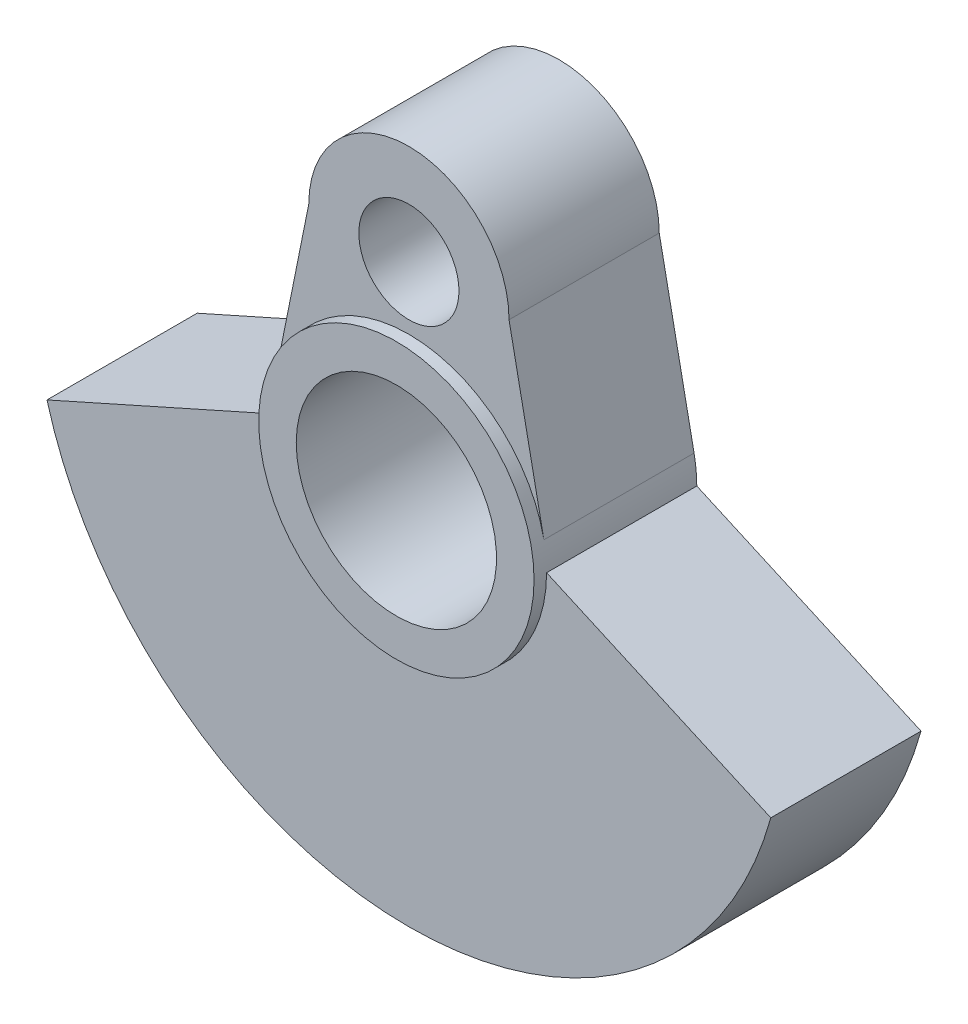
ISO-10303-21;
HEADER;
FILE_DESCRIPTION(('STEP AP214'),'2;1');
FILE_NAME('part.step','',(''),(''),'','','');
FILE_SCHEMA(('AUTOMOTIVE_DESIGN { 1 0 10303 214 1 1 1 1 }'));
ENDSEC;
DATA;
#1=APPLICATION_CONTEXT('core data for automotive mechanical design processes');
#2=APPLICATION_PROTOCOL_DEFINITION('international standard','automotive_design',2000,#1);
#3=PRODUCT_CONTEXT('',#1,'mechanical');
#4=PRODUCT('Part','Part','',(#3));
#5=PRODUCT_RELATED_PRODUCT_CATEGORY('part','',(#4));
#6=PRODUCT_DEFINITION_FORMATION('','',#4);
#7=PRODUCT_DEFINITION_CONTEXT('part definition',#1,'design');
#8=PRODUCT_DEFINITION('design','',#6,#7);
#9=PRODUCT_DEFINITION_SHAPE('','',#8);
#10=(LENGTH_UNIT() NAMED_UNIT(*) SI_UNIT(.MILLI.,.METRE.));
#11=(NAMED_UNIT(*) PLANE_ANGLE_UNIT() SI_UNIT($,.RADIAN.));
#12=(NAMED_UNIT(*) SI_UNIT($,.STERADIAN.) SOLID_ANGLE_UNIT());
#13=UNCERTAINTY_MEASURE_WITH_UNIT(LENGTH_MEASURE(1.E-05),#10,'distance_accuracy_value','');
#14=(GEOMETRIC_REPRESENTATION_CONTEXT(3) GLOBAL_UNCERTAINTY_ASSIGNED_CONTEXT((#13)) GLOBAL_UNIT_ASSIGNED_CONTEXT((#10,
#11,#12)) REPRESENTATION_CONTEXT('',''));
#15=CARTESIAN_POINT('',(0.,0.,0.));
#16=DIRECTION('',(0.,0.,1.));
#17=DIRECTION('',(1.,0.,0.));
#18=AXIS2_PLACEMENT_3D('',#15,#16,#17);
#19=CARTESIAN_POINT('',(0.,0.,3.5));
#20=DIRECTION('',(0.,0.,-1.));
#21=DIRECTION('',(-1.,0.,0.));
#22=AXIS2_PLACEMENT_3D('',#19,#20,#21);
#23=CYLINDRICAL_SURFACE('',#22,5.5);
#24=CARTESIAN_POINT('',(0.,0.,3.5));
#25=DIRECTION('',(0.,0.,1.));
#26=DIRECTION('',(1.,0.,0.));
#27=AXIS2_PLACEMENT_3D('',#24,#25,#26);
#28=CIRCLE('',#27,5.5);
#29=CARTESIAN_POINT('',(5.5,0.,3.5));
#30=VERTEX_POINT('',#29);
#31=EDGE_CURVE('E176',#30,#30,#28,.T.);
#32=ORIENTED_EDGE('',*,*,#31,.F.);
#33=EDGE_LOOP('',(#32));
#34=FACE_BOUND('',#33,.T.);
#35=DIRECTION('',(0.,0.,-1.));
#36=VECTOR('',#35,1.);
#37=CARTESIAN_POINT('',(5.39185239440812,1.08532380279594,3.));
#38=LINE('',#37,#36);
#39=CARTESIAN_POINT('',(5.39185239440812,1.08532380279594,3.));
#40=VERTEX_POINT('',#39);
#41=CARTESIAN_POINT('',(5.39185239440812,1.08532380279594,-3.));
#42=VERTEX_POINT('',#41);
#43=EDGE_CURVE('E70',#40,#42,#38,.T.);
#44=ORIENTED_EDGE('',*,*,#43,.F.);
#45=CARTESIAN_POINT('',(0.,0.,3.));
#46=DIRECTION('',(0.,0.,1.));
#47=DIRECTION('',(1.,0.,0.));
#48=AXIS2_PLACEMENT_3D('',#45,#46,#47);
#49=CIRCLE('',#48,5.5);
#50=CARTESIAN_POINT('',(-5.39185239440812,1.08532380279594,3.));
#51=VERTEX_POINT('',#50);
#52=EDGE_CURVE('E65',#40,#51,#49,.T.);
#53=ORIENTED_EDGE('',*,*,#52,.T.);
#54=DIRECTION('',(0.,0.,-1.));
#55=VECTOR('',#54,1.);
#56=CARTESIAN_POINT('',(-5.39185239440812,1.08532380279594,3.));
#57=LINE('',#56,#55);
#58=CARTESIAN_POINT('',(-5.39185239440812,1.08532380279594,-3.));
#59=VERTEX_POINT('',#58);
#60=EDGE_CURVE('E163',#51,#59,#57,.T.);
#61=ORIENTED_EDGE('',*,*,#60,.T.);
#62=CARTESIAN_POINT('',(0.,0.,-3.));
#63=DIRECTION('',(0.,0.,1.));
#64=DIRECTION('',(1.,0.,0.));
#65=AXIS2_PLACEMENT_3D('',#62,#63,#64);
#66=CIRCLE('',#65,5.5);
#67=CARTESIAN_POINT('',(-5.5,0.,-3.));
#68=VERTEX_POINT('',#67);
#69=EDGE_CURVE('E172',#59,#68,#66,.T.);
#70=ORIENTED_EDGE('',*,*,#69,.T.);
#71=DIRECTION('',(0.,0.,-1.));
#72=VECTOR('',#71,1.);
#73=CARTESIAN_POINT('',(-5.5,0.,3.));
#74=LINE('',#73,#72);
#75=CARTESIAN_POINT('',(-5.5,0.,3.));
#76=VERTEX_POINT('',#75);
#77=EDGE_CURVE('E199',#76,#68,#74,.T.);
#78=ORIENTED_EDGE('',*,*,#77,.F.);
#79=CARTESIAN_POINT('',(0.,0.,3.));
#80=DIRECTION('',(0.,0.,1.));
#81=DIRECTION('',(1.,0.,0.));
#82=AXIS2_PLACEMENT_3D('',#79,#80,#81);
#83=CIRCLE('',#82,5.5);
#84=CARTESIAN_POINT('',(5.5,0.,3.));
#85=VERTEX_POINT('',#84);
#86=EDGE_CURVE('E196',#76,#85,#83,.T.);
#87=ORIENTED_EDGE('',*,*,#86,.T.);
#88=DIRECTION('',(0.,0.,-1.));
#89=VECTOR('',#88,1.);
#90=CARTESIAN_POINT('',(5.5,0.,3.));
#91=LINE('',#90,#89);
#92=CARTESIAN_POINT('',(5.5,0.,-3.));
#93=VERTEX_POINT('',#92);
#94=EDGE_CURVE('E212',#85,#93,#91,.T.);
#95=ORIENTED_EDGE('',*,*,#94,.T.);
#96=EDGE_CURVE('E181',#93,#42,#66,.T.);
#97=ORIENTED_EDGE('',*,*,#96,.T.);
#98=EDGE_LOOP('',(#44,#53,#61,#70,#78,#87,#95,#97));
#99=FACE_BOUND('',#98,.T.);
#100=ADVANCED_FACE('F49',(#34,#99),#23,.T.);
#101=CARTESIAN_POINT('',(-0.914524728224361,2.04781115503851,3.));
#102=DIRECTION('',(-0.407771042759929,0.9130842111692,0.));
#103=DIRECTION('',(-0.9130842111692,-0.407771042759929,0.));
#104=AXIS2_PLACEMENT_3D('',#101,#102,#103);
#105=PLANE('',#104);
#106=DIRECTION('',(0.9130842111692,0.407771042759929,0.));
#107=VECTOR('',#106,1.);
#108=CARTESIAN_POINT('',(-0.914524728224361,2.04781115503851,-3.));
#109=LINE('',#108,#107);
#110=CARTESIAN_POINT('',(-14.456832294801,-4.,-3.));
#111=VERTEX_POINT('',#110);
#112=EDGE_CURVE('E180',#111,#68,#109,.T.);
#113=ORIENTED_EDGE('',*,*,#112,.F.);
#114=DIRECTION('',(0.,0.,-1.));
#115=VECTOR('',#114,1.);
#116=CARTESIAN_POINT('',(-14.456832294801,-4.,3.));
#117=LINE('',#116,#115);
#118=CARTESIAN_POINT('',(-14.456832294801,-4.,3.));
#119=VERTEX_POINT('',#118);
#120=EDGE_CURVE('E12',#119,#111,#117,.T.);
#121=ORIENTED_EDGE('',*,*,#120,.F.);
#122=DIRECTION('',(0.9130842111692,0.407771042759929,0.));
#123=VECTOR('',#122,1.);
#124=CARTESIAN_POINT('',(-0.914524728224361,2.04781115503851,3.));
#125=LINE('',#124,#123);
#126=EDGE_CURVE('E184',#119,#76,#125,.T.);
#127=ORIENTED_EDGE('',*,*,#126,.T.);
#128=ORIENTED_EDGE('',*,*,#77,.T.);
#129=EDGE_LOOP('',(#113,#121,#127,#128));
#130=FACE_BOUND('',#129,.T.);
#131=ADVANCED_FACE('F51',(#130),#105,.T.);
#132=CARTESIAN_POINT('',(0.,0.,3.));
#133=DIRECTION('',(0.,0.,-1.));
#134=DIRECTION('',(-1.,0.,0.));
#135=AXIS2_PLACEMENT_3D('',#132,#133,#134);
#136=CYLINDRICAL_SURFACE('',#135,15.);
#137=CARTESIAN_POINT('',(0.,0.,-3.));
#138=DIRECTION('',(0.,0.,1.));
#139=DIRECTION('',(1.,0.,0.));
#140=AXIS2_PLACEMENT_3D('',#137,#138,#139);
#141=CIRCLE('',#140,15.);
#142=CARTESIAN_POINT('',(14.456832294801,-4.,-3.));
#143=VERTEX_POINT('',#142);
#144=EDGE_CURVE('E203',#111,#143,#141,.T.);
#145=ORIENTED_EDGE('',*,*,#144,.T.);
#146=DIRECTION('',(0.,0.,-1.));
#147=VECTOR('',#146,1.);
#148=CARTESIAN_POINT('',(14.456832294801,-4.,3.));
#149=LINE('',#148,#147);
#150=CARTESIAN_POINT('',(14.456832294801,-4.,3.));
#151=VERTEX_POINT('',#150);
#152=EDGE_CURVE('E58',#151,#143,#149,.T.);
#153=ORIENTED_EDGE('',*,*,#152,.F.);
#154=CARTESIAN_POINT('',(0.,0.,3.));
#155=DIRECTION('',(0.,0.,1.));
#156=DIRECTION('',(1.,0.,0.));
#157=AXIS2_PLACEMENT_3D('',#154,#155,#156);
#158=CIRCLE('',#157,15.);
#159=EDGE_CURVE('E188',#119,#151,#158,.T.);
#160=ORIENTED_EDGE('',*,*,#159,.F.);
#161=ORIENTED_EDGE('',*,*,#120,.T.);
#162=EDGE_LOOP('',(#145,#153,#160,#161));
#163=FACE_BOUND('',#162,.T.);
#164=ADVANCED_FACE('F234',(#163),#136,.T.);
#165=CARTESIAN_POINT('',(0.914524728224361,2.04781115503851,3.));
#166=DIRECTION('',(-0.407771042759929,-0.9130842111692,0.));
#167=DIRECTION('',(0.9130842111692,-0.407771042759929,0.));
#168=AXIS2_PLACEMENT_3D('',#165,#166,#167);
#169=PLANE('',#168);
#170=DIRECTION('',(-0.9130842111692,0.407771042759929,0.));
#171=VECTOR('',#170,1.);
#172=CARTESIAN_POINT('',(0.914524728224361,2.04781115503851,-3.));
#173=LINE('',#172,#171);
#174=EDGE_CURVE('E189',#143,#93,#173,.T.);
#175=ORIENTED_EDGE('',*,*,#174,.T.);
#176=ORIENTED_EDGE('',*,*,#94,.F.);
#177=DIRECTION('',(-0.9130842111692,0.407771042759929,0.));
#178=VECTOR('',#177,1.);
#179=CARTESIAN_POINT('',(0.914524728224361,2.04781115503851,3.));
#180=LINE('',#179,#178);
#181=EDGE_CURVE('E192',#151,#85,#180,.T.);
#182=ORIENTED_EDGE('',*,*,#181,.F.);
#183=ORIENTED_EDGE('',*,*,#152,.T.);
#184=EDGE_LOOP('',(#175,#176,#182,#183));
#185=FACE_BOUND('',#184,.T.);
#186=ADVANCED_FACE('F221',(#185),#169,.F.);
#187=CARTESIAN_POINT('',(0.,0.,3.));
#188=DIRECTION('',(0.,0.,1.));
#189=DIRECTION('',(1.,0.,0.));
#190=AXIS2_PLACEMENT_3D('',#187,#188,#189);
#191=PLANE('',#190);
#192=ORIENTED_EDGE('',*,*,#126,.F.);
#193=ORIENTED_EDGE('',*,*,#159,.T.);
#194=ORIENTED_EDGE('',*,*,#181,.T.);
#195=ORIENTED_EDGE('',*,*,#86,.F.);
#196=EDGE_LOOP('',(#192,#193,#194,#195));
#197=FACE_BOUND('',#196,.T.);
#198=ADVANCED_FACE('F233',(#197),#191,.T.);
#199=CARTESIAN_POINT('',(0.,0.,-3.));
#200=DIRECTION('',(0.,0.,1.));
#201=DIRECTION('',(1.,0.,0.));
#202=AXIS2_PLACEMENT_3D('',#199,#200,#201);
#203=PLANE('',#202);
#204=ORIENTED_EDGE('',*,*,#112,.T.);
#205=ORIENTED_EDGE('',*,*,#69,.F.);
#206=DIRECTION('',(-0.197331600508353,-0.980336798983294,0.));
#207=VECTOR('',#206,1.);
#208=CARTESIAN_POINT('',(-5.39185239440812,1.08532380279594,-3.));
#209=LINE('',#208,#207);
#210=CARTESIAN_POINT('',(-4.,8.,-3.));
#211=VERTEX_POINT('',#210);
#212=EDGE_CURVE('E142',#211,#59,#209,.T.);
#213=ORIENTED_EDGE('',*,*,#212,.F.);
#214=CARTESIAN_POINT('',(0.,8.,-3.));
#215=DIRECTION('',(0.,0.,1.));
#216=DIRECTION('',(1.,0.,0.));
#217=AXIS2_PLACEMENT_3D('',#214,#215,#216);
#218=CIRCLE('',#217,4.);
#219=CARTESIAN_POINT('',(4.,8.,-3.));
#220=VERTEX_POINT('',#219);
#221=EDGE_CURVE('E155',#220,#211,#218,.T.);
#222=ORIENTED_EDGE('',*,*,#221,.F.);
#223=DIRECTION('',(0.197331600508353,-0.980336798983294,0.));
#224=VECTOR('',#223,1.);
#225=CARTESIAN_POINT('',(5.39185239440812,1.08532380279594,-3.));
#226=LINE('',#225,#224);
#227=EDGE_CURVE('E119',#220,#42,#226,.T.);
#228=ORIENTED_EDGE('',*,*,#227,.T.);
#229=ORIENTED_EDGE('',*,*,#96,.F.);
#230=ORIENTED_EDGE('',*,*,#174,.F.);
#231=ORIENTED_EDGE('',*,*,#144,.F.);
#232=EDGE_LOOP('',(#204,#205,#213,#222,#228,#229,#230,#231));
#233=FACE_BOUND('',#232,.T.);
#234=CARTESIAN_POINT('',(0.,0.,-3.));
#235=DIRECTION('',(0.,0.,1.));
#236=DIRECTION('',(1.,0.,0.));
#237=AXIS2_PLACEMENT_3D('',#234,#235,#236);
#238=CIRCLE('',#237,4.);
#239=CARTESIAN_POINT('',(-4.,0.,-3.));
#240=VERTEX_POINT('',#239);
#241=EDGE_CURVE('E124',#240,#240,#238,.T.);
#242=ORIENTED_EDGE('',*,*,#241,.T.);
#243=EDGE_LOOP('',(#242));
#244=FACE_BOUND('',#243,.T.);
#245=CARTESIAN_POINT('',(0.,8.,-3.));
#246=DIRECTION('',(0.,0.,1.));
#247=DIRECTION('',(1.,0.,0.));
#248=AXIS2_PLACEMENT_3D('',#245,#246,#247);
#249=CIRCLE('',#248,2.);
#250=CARTESIAN_POINT('',(2.,8.,-3.));
#251=VERTEX_POINT('',#250);
#252=EDGE_CURVE('E149',#251,#251,#249,.T.);
#253=ORIENTED_EDGE('',*,*,#252,.T.);
#254=EDGE_LOOP('',(#253));
#255=FACE_BOUND('',#254,.T.);
#256=ADVANCED_FACE('F227',(#233,#244,#255),#203,.F.);
#257=CARTESIAN_POINT('',(0.,0.,3.5));
#258=DIRECTION('',(0.,0.,1.));
#259=DIRECTION('',(1.,0.,0.));
#260=AXIS2_PLACEMENT_3D('',#257,#258,#259);
#261=PLANE('',#260);
#262=ORIENTED_EDGE('',*,*,#31,.T.);
#263=EDGE_LOOP('',(#262));
#264=FACE_BOUND('',#263,.T.);
#265=CARTESIAN_POINT('',(0.,0.,3.5));
#266=DIRECTION('',(0.,0.,1.));
#267=DIRECTION('',(1.,0.,0.));
#268=AXIS2_PLACEMENT_3D('',#265,#266,#267);
#269=CIRCLE('',#268,4.);
#270=CARTESIAN_POINT('',(-4.,0.,3.5));
#271=VERTEX_POINT('',#270);
#272=EDGE_CURVE('E168',#271,#271,#269,.T.);
#273=ORIENTED_EDGE('',*,*,#272,.F.);
#274=EDGE_LOOP('',(#273));
#275=FACE_BOUND('',#274,.T.);
#276=ADVANCED_FACE('F260',(#264,#275),#261,.T.);
#277=CARTESIAN_POINT('',(0.,0.,3.5));
#278=DIRECTION('',(0.,0.,-1.));
#279=DIRECTION('',(-1.,0.,0.));
#280=AXIS2_PLACEMENT_3D('',#277,#278,#279);
#281=CYLINDRICAL_SURFACE('',#280,4.);
#282=CARTESIAN_POINT('',(-4.,0.,3.5));
#283=CARTESIAN_POINT('',(-4.,0.,3.43229166666667));
#284=CARTESIAN_POINT('',(-4.,0.,3.36458333333333));
#285=CARTESIAN_POINT('',(-4.,0.,3.22916666666667));
#286=CARTESIAN_POINT('',(-4.,0.,3.16145833333333));
#287=CARTESIAN_POINT('',(-4.,0.,3.02604166666667));
#288=CARTESIAN_POINT('',(-4.,0.,2.95833333333333));
#289=CARTESIAN_POINT('',(-4.,0.,2.82291666666667));
#290=CARTESIAN_POINT('',(-4.,0.,2.75520833333333));
#291=CARTESIAN_POINT('',(-4.,0.,2.61979166666667));
#292=CARTESIAN_POINT('',(-4.,0.,2.55208333333333));
#293=CARTESIAN_POINT('',(-4.,0.,2.41666666666667));
#294=CARTESIAN_POINT('',(-4.,0.,2.34895833333333));
#295=CARTESIAN_POINT('',(-4.,0.,2.21354166666667));
#296=CARTESIAN_POINT('',(-4.,0.,2.14583333333333));
#297=CARTESIAN_POINT('',(-4.,0.,2.01041666666667));
#298=CARTESIAN_POINT('',(-4.,0.,1.94270833333333));
#299=CARTESIAN_POINT('',(-4.,0.,1.80729166666667));
#300=CARTESIAN_POINT('',(-4.,0.,1.73958333333333));
#301=CARTESIAN_POINT('',(-4.,0.,1.60416666666667));
#302=CARTESIAN_POINT('',(-4.,0.,1.53645833333333));
#303=CARTESIAN_POINT('',(-4.,0.,1.40104166666667));
#304=CARTESIAN_POINT('',(-4.,0.,1.33333333333333));
#305=CARTESIAN_POINT('',(-4.,0.,1.19791666666667));
#306=CARTESIAN_POINT('',(-4.,0.,1.13020833333333));
#307=CARTESIAN_POINT('',(-4.,0.,0.994791666666666));
#308=CARTESIAN_POINT('',(-4.,0.,0.927083333333333));
#309=CARTESIAN_POINT('',(-4.,0.,0.791666666666666));
#310=CARTESIAN_POINT('',(-4.,0.,0.723958333333333));
#311=CARTESIAN_POINT('',(-4.,0.,0.588541666666666));
#312=CARTESIAN_POINT('',(-4.,0.,0.520833333333333));
#313=CARTESIAN_POINT('',(-4.,0.,0.385416666666666));
#314=CARTESIAN_POINT('',(-4.,0.,0.317708333333333));
#315=CARTESIAN_POINT('',(-4.,0.,0.182291666666666));
#316=CARTESIAN_POINT('',(-4.,0.,0.114583333333333));
#317=CARTESIAN_POINT('',(-4.,0.,-0.0208333333333341));
#318=CARTESIAN_POINT('',(-4.,0.,-0.0885416666666673));
#319=CARTESIAN_POINT('',(-4.,0.,-0.223958333333334));
#320=CARTESIAN_POINT('',(-4.,0.,-0.291666666666667));
#321=CARTESIAN_POINT('',(-4.,0.,-0.427083333333334));
#322=CARTESIAN_POINT('',(-4.,0.,-0.494791666666667));
#323=CARTESIAN_POINT('',(-4.,0.,-0.630208333333333));
#324=CARTESIAN_POINT('',(-4.,0.,-0.697916666666666));
#325=CARTESIAN_POINT('',(-4.,0.,-0.833333333333333));
#326=CARTESIAN_POINT('',(-4.,0.,-0.901041666666667));
#327=CARTESIAN_POINT('',(-4.,0.,-1.03645833333333));
#328=CARTESIAN_POINT('',(-4.,0.,-1.10416666666667));
#329=CARTESIAN_POINT('',(-4.,0.,-1.23958333333333));
#330=CARTESIAN_POINT('',(-4.,0.,-1.30729166666667));
#331=CARTESIAN_POINT('',(-4.,0.,-1.44270833333333));
#332=CARTESIAN_POINT('',(-4.,0.,-1.51041666666667));
#333=CARTESIAN_POINT('',(-4.,0.,-1.64583333333333));
#334=CARTESIAN_POINT('',(-4.,0.,-1.71354166666667));
#335=CARTESIAN_POINT('',(-4.,0.,-1.84895833333333));
#336=CARTESIAN_POINT('',(-4.,0.,-1.91666666666667));
#337=CARTESIAN_POINT('',(-4.,0.,-2.05208333333333));
#338=CARTESIAN_POINT('',(-4.,0.,-2.11979166666667));
#339=CARTESIAN_POINT('',(-4.,0.,-2.25520833333333));
#340=CARTESIAN_POINT('',(-4.,0.,-2.32291666666667));
#341=CARTESIAN_POINT('',(-4.,0.,-2.45833333333333));
#342=CARTESIAN_POINT('',(-4.,0.,-2.52604166666667));
#343=CARTESIAN_POINT('',(-4.,0.,-2.66145833333333));
#344=CARTESIAN_POINT('',(-4.,0.,-2.72916666666667));
#345=CARTESIAN_POINT('',(-4.,0.,-2.86458333333333));
#346=CARTESIAN_POINT('',(-4.,0.,-2.93229166666667));
#347=CARTESIAN_POINT('',(-4.,0.,-3.));
#348=B_SPLINE_CURVE_WITH_KNOTS('',3,(#282,#283,#284,#285,#286,#287,#288,#289,#290,#291,#292,
#293,#294,#295,#296,#297,#298,#299,#300,#301,#302,#303,#304,#305,#306,#307,#308,#309,#310,#311,
#312,#313,#314,#315,#316,#317,#318,#319,#320,#321,#322,#323,#324,#325,#326,#327,#328,#329,#330,
#331,#332,#333,#334,#335,#336,#337,#338,#339,#340,#341,#342,#343,#344,#345,#346,#347),
.UNSPECIFIED.,.F.,.F.,(4,2,2,2,2,2,2,2,2,2,2,2,2,2,2,2,2,2,2,2,2,2,2,2,2,2,2,2,2,2,2,2,4),(0.,
0.203125,0.40625,0.609375,0.8125,1.015625,1.21875,1.421875,1.625,1.828125,2.03125,2.234375,
2.4375,2.640625,2.84375,3.046875,3.25,3.453125,3.65625,3.859375,4.0625,4.265625,4.46875,
4.671875,4.875,5.078125,5.28125,5.484375,5.6875,5.890625,6.09375,6.296875,6.5),.UNSPECIFIED.);
#349=EDGE_CURVE('BSEAM290',#271,#240,#348,.T.);
#350=ORIENTED_EDGE('',*,*,#272,.T.);
#351=ORIENTED_EDGE('',*,*,#241,.F.);
#352=ORIENTED_EDGE('',*,*,#349,.T.);
#353=ORIENTED_EDGE('',*,*,#349,.F.);
#354=EDGE_LOOP('',(#350,#352,#351,#353));
#355=FACE_BOUND('',#354,.T.);
#356=ADVANCED_FACE('F290',(#355),#281,.F.);
#357=CARTESIAN_POINT('',(5.39185239440812,1.08532380279594,3.));
#358=DIRECTION('',(0.980336798983294,0.197331600508353,0.));
#359=DIRECTION('',(-0.197331600508353,0.980336798983294,0.));
#360=AXIS2_PLACEMENT_3D('',#357,#358,#359);
#361=PLANE('',#360);
#362=ORIENTED_EDGE('',*,*,#227,.F.);
#363=DIRECTION('',(0.,0.,-1.));
#364=VECTOR('',#363,1.);
#365=CARTESIAN_POINT('',(4.,8.,3.));
#366=LINE('',#365,#364);
#367=CARTESIAN_POINT('',(4.,8.,3.));
#368=VERTEX_POINT('',#367);
#369=EDGE_CURVE('E113',#368,#220,#366,.T.);
#370=ORIENTED_EDGE('',*,*,#369,.F.);
#371=DIRECTION('',(0.197331600508353,-0.980336798983294,0.));
#372=VECTOR('',#371,1.);
#373=CARTESIAN_POINT('',(5.39185239440812,1.08532380279594,3.));
#374=LINE('',#373,#372);
#375=EDGE_CURVE('E117',#368,#40,#374,.T.);
#376=ORIENTED_EDGE('',*,*,#375,.T.);
#377=ORIENTED_EDGE('',*,*,#43,.T.);
#378=EDGE_LOOP('',(#362,#370,#376,#377));
#379=FACE_BOUND('',#378,.T.);
#380=ADVANCED_FACE('F115',(#379),#361,.T.);
#381=CARTESIAN_POINT('',(0.,8.,3.));
#382=DIRECTION('',(0.,0.,-1.));
#383=DIRECTION('',(-1.,0.,0.));
#384=AXIS2_PLACEMENT_3D('',#381,#382,#383);
#385=CYLINDRICAL_SURFACE('',#384,4.);
#386=ORIENTED_EDGE('',*,*,#221,.T.);
#387=DIRECTION('',(0.,0.,-1.));
#388=VECTOR('',#387,1.);
#389=CARTESIAN_POINT('',(-4.,8.,3.));
#390=LINE('',#389,#388);
#391=CARTESIAN_POINT('',(-4.,8.,3.));
#392=VERTEX_POINT('',#391);
#393=EDGE_CURVE('E125',#392,#211,#390,.T.);
#394=ORIENTED_EDGE('',*,*,#393,.F.);
#395=CARTESIAN_POINT('',(0.,8.,3.));
#396=DIRECTION('',(0.,0.,1.));
#397=DIRECTION('',(1.,0.,0.));
#398=AXIS2_PLACEMENT_3D('',#395,#396,#397);
#399=CIRCLE('',#398,4.);
#400=EDGE_CURVE('E129',#368,#392,#399,.T.);
#401=ORIENTED_EDGE('',*,*,#400,.F.);
#402=ORIENTED_EDGE('',*,*,#369,.T.);
#403=EDGE_LOOP('',(#386,#394,#401,#402));
#404=FACE_BOUND('',#403,.T.);
#405=ADVANCED_FACE('F130',(#404),#385,.T.);
#406=CARTESIAN_POINT('',(-5.39185239440812,1.08532380279594,3.));
#407=DIRECTION('',(0.980336798983294,-0.197331600508353,0.));
#408=DIRECTION('',(0.197331600508353,0.980336798983294,0.));
#409=AXIS2_PLACEMENT_3D('',#406,#407,#408);
#410=PLANE('',#409);
#411=ORIENTED_EDGE('',*,*,#212,.T.);
#412=ORIENTED_EDGE('',*,*,#60,.F.);
#413=DIRECTION('',(-0.197331600508353,-0.980336798983294,0.));
#414=VECTOR('',#413,1.);
#415=CARTESIAN_POINT('',(-5.39185239440812,1.08532380279594,3.));
#416=LINE('',#415,#414);
#417=EDGE_CURVE('E134',#392,#51,#416,.T.);
#418=ORIENTED_EDGE('',*,*,#417,.F.);
#419=ORIENTED_EDGE('',*,*,#393,.T.);
#420=EDGE_LOOP('',(#411,#412,#418,#419));
#421=FACE_BOUND('',#420,.T.);
#422=ADVANCED_FACE('F239',(#421),#410,.F.);
#423=CARTESIAN_POINT('',(0.,8.,3.));
#424=DIRECTION('',(0.,0.,-1.));
#425=DIRECTION('',(-1.,0.,0.));
#426=AXIS2_PLACEMENT_3D('',#423,#424,#425);
#427=CYLINDRICAL_SURFACE('',#426,2.);
#428=CARTESIAN_POINT('',(0.,8.,3.));
#429=DIRECTION('',(0.,0.,1.));
#430=DIRECTION('',(1.,0.,0.));
#431=AXIS2_PLACEMENT_3D('',#428,#429,#430);
#432=CIRCLE('',#431,2.);
#433=CARTESIAN_POINT('',(2.,8.,3.));
#434=VERTEX_POINT('',#433);
#435=EDGE_CURVE('E138',#434,#434,#432,.T.);
#436=ORIENTED_EDGE('',*,*,#435,.T.);
#437=EDGE_LOOP('',(#436));
#438=FACE_BOUND('',#437,.T.);
#439=ORIENTED_EDGE('',*,*,#252,.F.);
#440=EDGE_LOOP('',(#439));
#441=FACE_BOUND('',#440,.T.);
#442=ADVANCED_FACE('F241',(#438,#441),#427,.F.);
#443=CARTESIAN_POINT('',(0.,0.,3.));
#444=DIRECTION('',(0.,0.,1.));
#445=DIRECTION('',(1.,0.,0.));
#446=AXIS2_PLACEMENT_3D('',#443,#444,#445);
#447=PLANE('',#446);
#448=ORIENTED_EDGE('',*,*,#435,.F.);
#449=EDGE_LOOP('',(#448));
#450=FACE_BOUND('',#449,.T.);
#451=ORIENTED_EDGE('',*,*,#375,.F.);
#452=ORIENTED_EDGE('',*,*,#400,.T.);
#453=ORIENTED_EDGE('',*,*,#417,.T.);
#454=ORIENTED_EDGE('',*,*,#52,.F.);
#455=EDGE_LOOP('',(#451,#452,#453,#454));
#456=FACE_BOUND('',#455,.T.);
#457=ADVANCED_FACE('F136',(#450,#456),#447,.T.);
#458=CLOSED_SHELL('',(#100,#131,#164,#186,#198,#256,#276,#356,#380,#405,#422,#442,#457));
#459=MANIFOLD_SOLID_BREP('B2',#458);
#460=ADVANCED_BREP_SHAPE_REPRESENTATION('',(#18,#459),#14);
#461=SHAPE_DEFINITION_REPRESENTATION(#9,#460);
ENDSEC;
END-ISO-10303-21;
